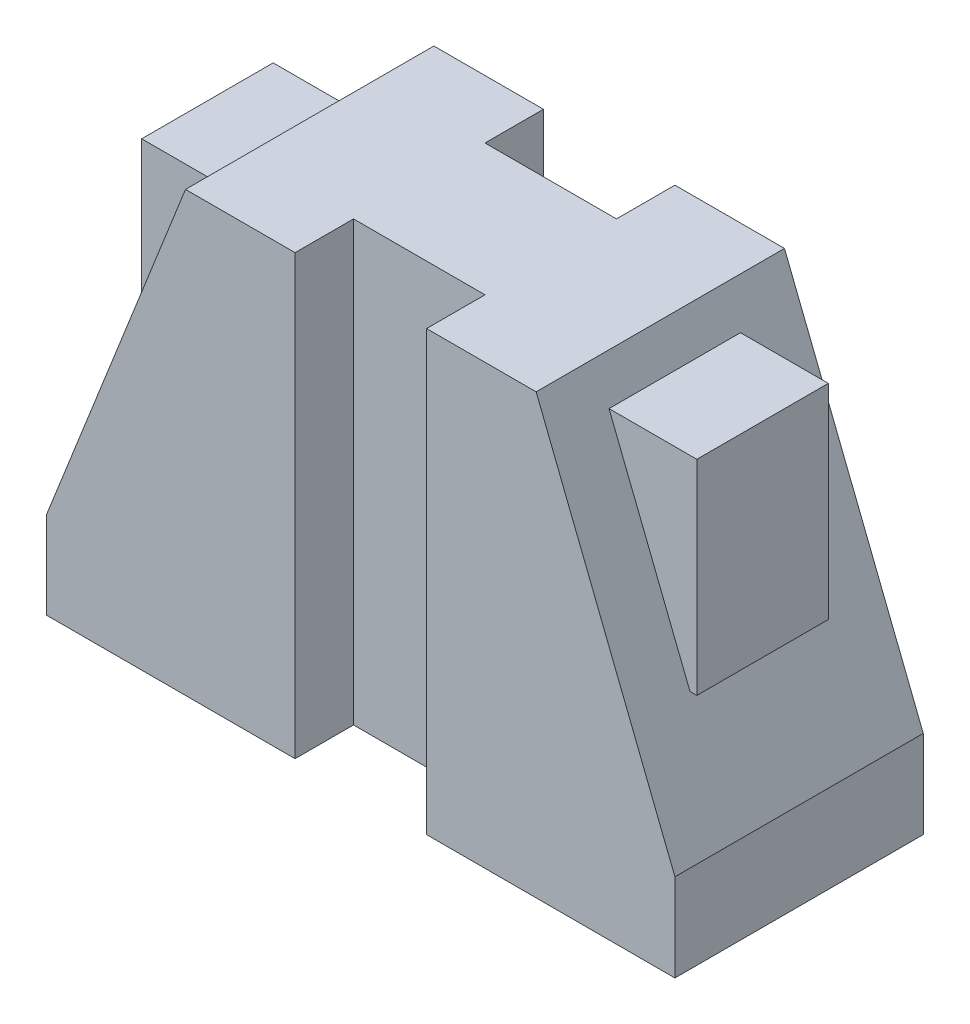
ISO-10303-21;
HEADER;
FILE_DESCRIPTION(('STEP AP214'),'2;1');
FILE_NAME('part.step','',(''),(''),'','','');
FILE_SCHEMA(('AUTOMOTIVE_DESIGN { 1 0 10303 214 1 1 1 1 }'));
ENDSEC;
DATA;
#1=APPLICATION_CONTEXT('core data for automotive mechanical design processes');
#2=APPLICATION_PROTOCOL_DEFINITION('international standard','automotive_design',2000,#1);
#3=PRODUCT_CONTEXT('',#1,'mechanical');
#4=PRODUCT('Part','Part','',(#3));
#5=PRODUCT_RELATED_PRODUCT_CATEGORY('part','',(#4));
#6=PRODUCT_DEFINITION_FORMATION('','',#4);
#7=PRODUCT_DEFINITION_CONTEXT('part definition',#1,'design');
#8=PRODUCT_DEFINITION('design','',#6,#7);
#9=PRODUCT_DEFINITION_SHAPE('','',#8);
#10=(LENGTH_UNIT() NAMED_UNIT(*) SI_UNIT(.MILLI.,.METRE.));
#11=(NAMED_UNIT(*) PLANE_ANGLE_UNIT() SI_UNIT($,.RADIAN.));
#12=(NAMED_UNIT(*) SI_UNIT($,.STERADIAN.) SOLID_ANGLE_UNIT());
#13=UNCERTAINTY_MEASURE_WITH_UNIT(LENGTH_MEASURE(1.E-05),#10,'distance_accuracy_value','');
#14=(GEOMETRIC_REPRESENTATION_CONTEXT(3) GLOBAL_UNCERTAINTY_ASSIGNED_CONTEXT((#13)) GLOBAL_UNIT_ASSIGNED_CONTEXT((#10,
#11,#12)) REPRESENTATION_CONTEXT('',''));
#15=CARTESIAN_POINT('',(0.,0.,0.));
#16=DIRECTION('',(0.,0.,1.));
#17=DIRECTION('',(1.,0.,0.));
#18=AXIS2_PLACEMENT_3D('',#15,#16,#17);
#19=CARTESIAN_POINT('',(-43.,-18.,-17.));
#20=DIRECTION('',(0.929806613071272,-0.368048451007378,0.));
#21=DIRECTION('',(0.368048451007378,0.929806613071272,0.));
#22=AXIS2_PLACEMENT_3D('',#19,#20,#21);
#23=PLANE('',#22);
#24=DIRECTION('',(0.,0.,1.));
#25=VECTOR('',#24,1.);
#26=CARTESIAN_POINT('',(-24.,30.,-17.));
#27=LINE('',#26,#25);
#28=CARTESIAN_POINT('',(-24.,30.,-17.));
#29=VERTEX_POINT('',#28);
#30=CARTESIAN_POINT('',(-24.,30.,17.));
#31=VERTEX_POINT('',#30);
#32=EDGE_CURVE('E231',#29,#31,#27,.T.);
#33=ORIENTED_EDGE('',*,*,#32,.F.);
#34=DIRECTION('',(0.368048451007378,0.929806613071272,0.));
#35=VECTOR('',#34,1.);
#36=CARTESIAN_POINT('',(-43.,-18.,-17.));
#37=LINE('',#36,#35);
#38=CARTESIAN_POINT('',(-43.,-18.,-17.));
#39=VERTEX_POINT('',#38);
#40=EDGE_CURVE('E227',#39,#29,#37,.T.);
#41=ORIENTED_EDGE('',*,*,#40,.F.);
#42=DIRECTION('',(0.,0.,1.));
#43=VECTOR('',#42,1.);
#44=CARTESIAN_POINT('',(-43.,-18.,-17.));
#45=LINE('',#44,#43);
#46=CARTESIAN_POINT('',(-43.,-18.,17.));
#47=VERTEX_POINT('',#46);
#48=EDGE_CURVE('E230',#39,#47,#45,.T.);
#49=ORIENTED_EDGE('',*,*,#48,.T.);
#50=DIRECTION('',(0.368048451007378,0.929806613071272,0.));
#51=VECTOR('',#50,1.);
#52=CARTESIAN_POINT('',(-43.,-18.,17.));
#53=LINE('',#52,#51);
#54=EDGE_CURVE('E224',#47,#31,#53,.T.);
#55=ORIENTED_EDGE('',*,*,#54,.T.);
#56=EDGE_LOOP('',(#33,#41,#49,#55));
#57=FACE_BOUND('',#56,.T.);
#58=DIRECTION('',(-0.368048451007378,-0.929806613071272,0.));
#59=VECTOR('',#58,1.);
#60=CARTESIAN_POINT('',(-43.,-18.,-9.));
#61=LINE('',#60,#59);
#62=CARTESIAN_POINT('',(-25.9791666666667,25.,-9.));
#63=VERTEX_POINT('',#62);
#64=CARTESIAN_POINT('',(-37.0625,-3.,-9.));
#65=VERTEX_POINT('',#64);
#66=EDGE_CURVE('E48',#63,#65,#61,.T.);
#67=ORIENTED_EDGE('',*,*,#66,.F.);
#68=DIRECTION('',(0.,0.,-1.));
#69=VECTOR('',#68,1.);
#70=CARTESIAN_POINT('',(-25.9791666666667,25.,-17.));
#71=LINE('',#70,#69);
#72=CARTESIAN_POINT('',(-25.9791666666667,25.,9.));
#73=VERTEX_POINT('',#72);
#74=EDGE_CURVE('E52',#73,#63,#71,.T.);
#75=ORIENTED_EDGE('',*,*,#74,.F.);
#76=DIRECTION('',(0.368048451007378,0.929806613071272,0.));
#77=VECTOR('',#76,1.);
#78=CARTESIAN_POINT('',(-43.,-18.,9.));
#79=LINE('',#78,#77);
#80=CARTESIAN_POINT('',(-37.0625,-3.,9.));
#81=VERTEX_POINT('',#80);
#82=EDGE_CURVE('E207',#81,#73,#79,.T.);
#83=ORIENTED_EDGE('',*,*,#82,.F.);
#84=DIRECTION('',(0.,0.,1.));
#85=VECTOR('',#84,1.);
#86=CARTESIAN_POINT('',(-37.0625,-3.,-17.));
#87=LINE('',#86,#85);
#88=EDGE_CURVE('E203',#65,#81,#87,.T.);
#89=ORIENTED_EDGE('',*,*,#88,.F.);
#90=EDGE_LOOP('',(#67,#75,#83,#89));
#91=FACE_BOUND('',#90,.T.);
#92=ADVANCED_FACE('F33',(#57,#91),#23,.F.);
#93=CARTESIAN_POINT('',(43.,-18.,-17.));
#94=DIRECTION('',(0.929806613071272,0.368048451007378,0.));
#95=DIRECTION('',(-0.368048451007378,0.929806613071272,0.));
#96=AXIS2_PLACEMENT_3D('',#93,#94,#95);
#97=PLANE('',#96);
#98=DIRECTION('',(0.,0.,1.));
#99=VECTOR('',#98,1.);
#100=CARTESIAN_POINT('',(43.,-18.,-17.));
#101=LINE('',#100,#99);
#102=CARTESIAN_POINT('',(43.,-18.,-17.));
#103=VERTEX_POINT('',#102);
#104=CARTESIAN_POINT('',(43.,-18.,17.));
#105=VERTEX_POINT('',#104);
#106=EDGE_CURVE('E221',#103,#105,#101,.T.);
#107=ORIENTED_EDGE('',*,*,#106,.F.);
#108=DIRECTION('',(-0.368048451007378,0.929806613071272,0.));
#109=VECTOR('',#108,1.);
#110=CARTESIAN_POINT('',(43.,-18.,-17.));
#111=LINE('',#110,#109);
#112=CARTESIAN_POINT('',(24.,30.,-17.));
#113=VERTEX_POINT('',#112);
#114=EDGE_CURVE('E218',#103,#113,#111,.T.);
#115=ORIENTED_EDGE('',*,*,#114,.T.);
#116=DIRECTION('',(0.,0.,1.));
#117=VECTOR('',#116,1.);
#118=CARTESIAN_POINT('',(24.,30.,-17.));
#119=LINE('',#118,#117);
#120=CARTESIAN_POINT('',(24.,30.,17.));
#121=VERTEX_POINT('',#120);
#122=EDGE_CURVE('E220',#113,#121,#119,.T.);
#123=ORIENTED_EDGE('',*,*,#122,.T.);
#124=DIRECTION('',(-0.368048451007378,0.929806613071272,0.));
#125=VECTOR('',#124,1.);
#126=CARTESIAN_POINT('',(43.,-18.,17.));
#127=LINE('',#126,#125);
#128=EDGE_CURVE('E215',#105,#121,#127,.T.);
#129=ORIENTED_EDGE('',*,*,#128,.F.);
#130=EDGE_LOOP('',(#107,#115,#123,#129));
#131=FACE_BOUND('',#130,.T.);
#132=DIRECTION('',(0.,0.,-1.));
#133=VECTOR('',#132,1.);
#134=CARTESIAN_POINT('',(25.9791666666667,25.,-17.));
#135=LINE('',#134,#133);
#136=CARTESIAN_POINT('',(25.9791666666667,25.,9.));
#137=VERTEX_POINT('',#136);
#138=CARTESIAN_POINT('',(25.9791666666667,25.,-9.));
#139=VERTEX_POINT('',#138);
#140=EDGE_CURVE('E41',#137,#139,#135,.T.);
#141=ORIENTED_EDGE('',*,*,#140,.T.);
#142=DIRECTION('',(0.368048451007378,-0.929806613071272,0.));
#143=VECTOR('',#142,1.);
#144=CARTESIAN_POINT('',(43.,-18.,-9.));
#145=LINE('',#144,#143);
#146=CARTESIAN_POINT('',(37.0625,-3.,-9.));
#147=VERTEX_POINT('',#146);
#148=EDGE_CURVE('E11',#139,#147,#145,.T.);
#149=ORIENTED_EDGE('',*,*,#148,.T.);
#150=DIRECTION('',(0.,0.,1.));
#151=VECTOR('',#150,1.);
#152=CARTESIAN_POINT('',(37.0625,-3.,-17.));
#153=LINE('',#152,#151);
#154=CARTESIAN_POINT('',(37.0625,-3.,9.));
#155=VERTEX_POINT('',#154);
#156=EDGE_CURVE('E316',#147,#155,#153,.T.);
#157=ORIENTED_EDGE('',*,*,#156,.T.);
#158=DIRECTION('',(-0.368048451007378,0.929806613071272,0.));
#159=VECTOR('',#158,1.);
#160=CARTESIAN_POINT('',(43.,-18.,9.));
#161=LINE('',#160,#159);
#162=EDGE_CURVE('E319',#155,#137,#161,.T.);
#163=ORIENTED_EDGE('',*,*,#162,.T.);
#164=EDGE_LOOP('',(#141,#149,#157,#163));
#165=FACE_BOUND('',#164,.T.);
#166=ADVANCED_FACE('F322',(#131,#165),#97,.T.);
#167=CARTESIAN_POINT('',(-43.,30.,17.));
#168=DIRECTION('',(0.,-1.,0.));
#169=DIRECTION('',(0.,0.,-1.));
#170=AXIS2_PLACEMENT_3D('',#167,#168,#169);
#171=PLANE('',#170);
#172=ORIENTED_EDGE('',*,*,#122,.F.);
#173=DIRECTION('',(-1.,0.,0.));
#174=VECTOR('',#173,1.);
#175=CARTESIAN_POINT('',(-43.,30.,-17.));
#176=LINE('',#175,#174);
#177=CARTESIAN_POINT('',(9.,30.,-17.));
#178=VERTEX_POINT('',#177);
#179=EDGE_CURVE('E304',#113,#178,#176,.T.);
#180=ORIENTED_EDGE('',*,*,#179,.T.);
#181=DIRECTION('',(0.,0.,1.));
#182=VECTOR('',#181,1.);
#183=CARTESIAN_POINT('',(9.,30.,-9.));
#184=LINE('',#183,#182);
#185=CARTESIAN_POINT('',(9.,30.,-9.));
#186=VERTEX_POINT('',#185);
#187=EDGE_CURVE('E234',#178,#186,#184,.T.);
#188=ORIENTED_EDGE('',*,*,#187,.T.);
#189=DIRECTION('',(-1.,0.,0.));
#190=VECTOR('',#189,1.);
#191=CARTESIAN_POINT('',(-9.,30.,-9.));
#192=LINE('',#191,#190);
#193=CARTESIAN_POINT('',(-9.,30.,-9.));
#194=VERTEX_POINT('',#193);
#195=EDGE_CURVE('E241',#186,#194,#192,.T.);
#196=ORIENTED_EDGE('',*,*,#195,.T.);
#197=DIRECTION('',(0.,0.,-1.));
#198=VECTOR('',#197,1.);
#199=CARTESIAN_POINT('',(-9.,30.,-9.));
#200=LINE('',#199,#198);
#201=CARTESIAN_POINT('',(-9.,30.,-17.));
#202=VERTEX_POINT('',#201);
#203=EDGE_CURVE('E238',#194,#202,#200,.T.);
#204=ORIENTED_EDGE('',*,*,#203,.T.);
#205=EDGE_CURVE('E303',#202,#29,#176,.T.);
#206=ORIENTED_EDGE('',*,*,#205,.T.);
#207=ORIENTED_EDGE('',*,*,#32,.T.);
#208=DIRECTION('',(-1.,0.,0.));
#209=VECTOR('',#208,1.);
#210=CARTESIAN_POINT('',(-43.,30.,17.));
#211=LINE('',#210,#209);
#212=CARTESIAN_POINT('',(-9.,30.,17.));
#213=VERTEX_POINT('',#212);
#214=EDGE_CURVE('E290',#213,#31,#211,.T.);
#215=ORIENTED_EDGE('',*,*,#214,.F.);
#216=DIRECTION('',(0.,0.,1.));
#217=VECTOR('',#216,1.);
#218=CARTESIAN_POINT('',(-9.,30.,9.));
#219=LINE('',#218,#217);
#220=CARTESIAN_POINT('',(-9.,30.,9.));
#221=VERTEX_POINT('',#220);
#222=EDGE_CURVE('E265',#221,#213,#219,.T.);
#223=ORIENTED_EDGE('',*,*,#222,.F.);
#224=DIRECTION('',(-1.,0.,0.));
#225=VECTOR('',#224,1.);
#226=CARTESIAN_POINT('',(-9.,30.,9.));
#227=LINE('',#226,#225);
#228=CARTESIAN_POINT('',(9.,30.,9.));
#229=VERTEX_POINT('',#228);
#230=EDGE_CURVE('E262',#229,#221,#227,.T.);
#231=ORIENTED_EDGE('',*,*,#230,.F.);
#232=DIRECTION('',(0.,0.,-1.));
#233=VECTOR('',#232,1.);
#234=CARTESIAN_POINT('',(9.,30.,9.));
#235=LINE('',#234,#233);
#236=CARTESIAN_POINT('',(9.,30.,17.));
#237=VERTEX_POINT('',#236);
#238=EDGE_CURVE('E253',#237,#229,#235,.T.);
#239=ORIENTED_EDGE('',*,*,#238,.F.);
#240=EDGE_CURVE('E292',#121,#237,#211,.T.);
#241=ORIENTED_EDGE('',*,*,#240,.F.);
#242=EDGE_LOOP('',(#172,#180,#188,#196,#204,#206,#207,#215,#223,#231,#239,#241));
#243=FACE_BOUND('',#242,.T.);
#244=ADVANCED_FACE('F371',(#243),#171,.F.);
#245=CARTESIAN_POINT('',(0.,0.,-17.));
#246=DIRECTION('',(0.,0.,-1.));
#247=DIRECTION('',(-1.,0.,0.));
#248=AXIS2_PLACEMENT_3D('',#245,#246,#247);
#249=PLANE('',#248);
#250=ORIENTED_EDGE('',*,*,#179,.F.);
#251=ORIENTED_EDGE('',*,*,#114,.F.);
#252=DIRECTION('',(0.,1.,0.));
#253=VECTOR('',#252,1.);
#254=CARTESIAN_POINT('',(43.,-30.,-17.));
#255=LINE('',#254,#253);
#256=CARTESIAN_POINT('',(43.,-30.,-17.));
#257=VERTEX_POINT('',#256);
#258=EDGE_CURVE('E280',#257,#103,#255,.T.);
#259=ORIENTED_EDGE('',*,*,#258,.F.);
#260=DIRECTION('',(1.,0.,0.));
#261=VECTOR('',#260,1.);
#262=CARTESIAN_POINT('',(-43.,-30.,-17.));
#263=LINE('',#262,#261);
#264=CARTESIAN_POINT('',(9.,-30.,-17.));
#265=VERTEX_POINT('',#264);
#266=EDGE_CURVE('E308',#265,#257,#263,.T.);
#267=ORIENTED_EDGE('',*,*,#266,.F.);
#268=DIRECTION('',(0.,1.,0.));
#269=VECTOR('',#268,1.);
#270=CARTESIAN_POINT('',(9.,-30.,-17.));
#271=LINE('',#270,#269);
#272=EDGE_CURVE('E250',#265,#178,#271,.T.);
#273=ORIENTED_EDGE('',*,*,#272,.T.);
#274=EDGE_LOOP('',(#250,#251,#259,#267,#273));
#275=FACE_BOUND('',#274,.T.);
#276=ADVANCED_FACE('F405',(#275),#249,.T.);
#277=CARTESIAN_POINT('',(0.,0.,17.));
#278=DIRECTION('',(0.,0.,-1.));
#279=DIRECTION('',(-1.,0.,0.));
#280=AXIS2_PLACEMENT_3D('',#277,#278,#279);
#281=PLANE('',#280);
#282=ORIENTED_EDGE('',*,*,#128,.T.);
#283=ORIENTED_EDGE('',*,*,#240,.T.);
#284=DIRECTION('',(0.,1.,0.));
#285=VECTOR('',#284,1.);
#286=CARTESIAN_POINT('',(9.,-30.,17.));
#287=LINE('',#286,#285);
#288=CARTESIAN_POINT('',(9.,-30.,17.));
#289=VERTEX_POINT('',#288);
#290=EDGE_CURVE('E277',#289,#237,#287,.T.);
#291=ORIENTED_EDGE('',*,*,#290,.F.);
#292=DIRECTION('',(1.,0.,0.));
#293=VECTOR('',#292,1.);
#294=CARTESIAN_POINT('',(-43.,-30.,17.));
#295=LINE('',#294,#293);
#296=CARTESIAN_POINT('',(43.,-30.,17.));
#297=VERTEX_POINT('',#296);
#298=EDGE_CURVE('E296',#289,#297,#295,.T.);
#299=ORIENTED_EDGE('',*,*,#298,.T.);
#300=DIRECTION('',(0.,1.,0.));
#301=VECTOR('',#300,1.);
#302=CARTESIAN_POINT('',(43.,-30.,17.));
#303=LINE('',#302,#301);
#304=EDGE_CURVE('E287',#297,#105,#303,.T.);
#305=ORIENTED_EDGE('',*,*,#304,.T.);
#306=EDGE_LOOP('',(#282,#283,#291,#299,#305));
#307=FACE_BOUND('',#306,.T.);
#308=ADVANCED_FACE('F404',(#307),#281,.F.);
#309=CARTESIAN_POINT('',(43.,-30.,17.));
#310=DIRECTION('',(-1.,0.,0.));
#311=DIRECTION('',(0.,0.,1.));
#312=AXIS2_PLACEMENT_3D('',#309,#310,#311);
#313=PLANE('',#312);
#314=ORIENTED_EDGE('',*,*,#106,.T.);
#315=ORIENTED_EDGE('',*,*,#304,.F.);
#316=DIRECTION('',(0.,0.,-1.));
#317=VECTOR('',#316,1.);
#318=CARTESIAN_POINT('',(43.,-30.,17.));
#319=LINE('',#318,#317);
#320=EDGE_CURVE('E300',#297,#257,#319,.T.);
#321=ORIENTED_EDGE('',*,*,#320,.T.);
#322=ORIENTED_EDGE('',*,*,#258,.T.);
#323=EDGE_LOOP('',(#314,#315,#321,#322));
#324=FACE_BOUND('',#323,.T.);
#325=ADVANCED_FACE('F35',(#324),#313,.F.);
#326=CARTESIAN_POINT('',(-43.,-30.,17.));
#327=DIRECTION('',(0.,1.,0.));
#328=DIRECTION('',(0.,0.,1.));
#329=AXIS2_PLACEMENT_3D('',#326,#327,#328);
#330=PLANE('',#329);
#331=DIRECTION('',(0.,0.,1.));
#332=VECTOR('',#331,1.);
#333=CARTESIAN_POINT('',(9.,-30.,-9.));
#334=LINE('',#333,#332);
#335=CARTESIAN_POINT('',(9.,-30.,-9.));
#336=VERTEX_POINT('',#335);
#337=EDGE_CURVE('E244',#265,#336,#334,.T.);
#338=ORIENTED_EDGE('',*,*,#337,.F.);
#339=ORIENTED_EDGE('',*,*,#266,.T.);
#340=ORIENTED_EDGE('',*,*,#320,.F.);
#341=ORIENTED_EDGE('',*,*,#298,.F.);
#342=DIRECTION('',(0.,0.,-1.));
#343=VECTOR('',#342,1.);
#344=CARTESIAN_POINT('',(9.,-30.,9.));
#345=LINE('',#344,#343);
#346=CARTESIAN_POINT('',(9.,-30.,9.));
#347=VERTEX_POINT('',#346);
#348=EDGE_CURVE('E267',#289,#347,#345,.T.);
#349=ORIENTED_EDGE('',*,*,#348,.T.);
#350=DIRECTION('',(-1.,0.,0.));
#351=VECTOR('',#350,1.);
#352=CARTESIAN_POINT('',(-9.,-30.,9.));
#353=LINE('',#352,#351);
#354=CARTESIAN_POINT('',(-9.,-30.,9.));
#355=VERTEX_POINT('',#354);
#356=EDGE_CURVE('E270',#347,#355,#353,.T.);
#357=ORIENTED_EDGE('',*,*,#356,.T.);
#358=DIRECTION('',(0.,0.,1.));
#359=VECTOR('',#358,1.);
#360=CARTESIAN_POINT('',(-9.,-30.,9.));
#361=LINE('',#360,#359);
#362=CARTESIAN_POINT('',(-9.,-30.,17.));
#363=VERTEX_POINT('',#362);
#364=EDGE_CURVE('E273',#355,#363,#361,.T.);
#365=ORIENTED_EDGE('',*,*,#364,.T.);
#366=CARTESIAN_POINT('',(-43.,-30.,17.));
#367=VERTEX_POINT('',#366);
#368=EDGE_CURVE('E297',#367,#363,#295,.T.);
#369=ORIENTED_EDGE('',*,*,#368,.F.);
#370=DIRECTION('',(0.,0.,-1.));
#371=VECTOR('',#370,1.);
#372=CARTESIAN_POINT('',(-43.,-30.,17.));
#373=LINE('',#372,#371);
#374=CARTESIAN_POINT('',(-43.,-30.,-17.));
#375=VERTEX_POINT('',#374);
#376=EDGE_CURVE('E313',#367,#375,#373,.T.);
#377=ORIENTED_EDGE('',*,*,#376,.T.);
#378=CARTESIAN_POINT('',(-9.,-30.,-17.));
#379=VERTEX_POINT('',#378);
#380=EDGE_CURVE('E291',#375,#379,#263,.T.);
#381=ORIENTED_EDGE('',*,*,#380,.T.);
#382=DIRECTION('',(0.,0.,-1.));
#383=VECTOR('',#382,1.);
#384=CARTESIAN_POINT('',(-9.,-30.,-9.));
#385=LINE('',#384,#383);
#386=CARTESIAN_POINT('',(-9.,-30.,-9.));
#387=VERTEX_POINT('',#386);
#388=EDGE_CURVE('E246',#387,#379,#385,.T.);
#389=ORIENTED_EDGE('',*,*,#388,.F.);
#390=DIRECTION('',(-1.,0.,0.));
#391=VECTOR('',#390,1.);
#392=CARTESIAN_POINT('',(-9.,-30.,-9.));
#393=LINE('',#392,#391);
#394=EDGE_CURVE('E248',#336,#387,#393,.T.);
#395=ORIENTED_EDGE('',*,*,#394,.F.);
#396=EDGE_LOOP('',(#338,#339,#340,#341,#349,#357,#365,#369,#377,#381,#389,#395));
#397=FACE_BOUND('',#396,.T.);
#398=ADVANCED_FACE('F410',(#397),#330,.F.);
#399=ORIENTED_EDGE('',*,*,#40,.T.);
#400=ORIENTED_EDGE('',*,*,#205,.F.);
#401=DIRECTION('',(0.,1.,0.));
#402=VECTOR('',#401,1.);
#403=CARTESIAN_POINT('',(-9.,-30.,-17.));
#404=LINE('',#403,#402);
#405=EDGE_CURVE('E256',#379,#202,#404,.T.);
#406=ORIENTED_EDGE('',*,*,#405,.F.);
#407=ORIENTED_EDGE('',*,*,#380,.F.);
#408=DIRECTION('',(0.,-1.,0.));
#409=VECTOR('',#408,1.);
#410=CARTESIAN_POINT('',(-43.,-30.,-17.));
#411=LINE('',#410,#409);
#412=EDGE_CURVE('E306',#39,#375,#411,.T.);
#413=ORIENTED_EDGE('',*,*,#412,.F.);
#414=EDGE_LOOP('',(#399,#400,#406,#407,#413));
#415=FACE_BOUND('',#414,.T.);
#416=ADVANCED_FACE('F409',(#415),#249,.T.);
#417=CARTESIAN_POINT('',(-43.,-30.,17.));
#418=DIRECTION('',(1.,0.,0.));
#419=DIRECTION('',(0.,0.,-1.));
#420=AXIS2_PLACEMENT_3D('',#417,#418,#419);
#421=PLANE('',#420);
#422=DIRECTION('',(0.,-1.,0.));
#423=VECTOR('',#422,1.);
#424=CARTESIAN_POINT('',(-43.,-30.,17.));
#425=LINE('',#424,#423);
#426=EDGE_CURVE('E294',#47,#367,#425,.T.);
#427=ORIENTED_EDGE('',*,*,#426,.F.);
#428=ORIENTED_EDGE('',*,*,#48,.F.);
#429=ORIENTED_EDGE('',*,*,#412,.T.);
#430=ORIENTED_EDGE('',*,*,#376,.F.);
#431=EDGE_LOOP('',(#427,#428,#429,#430));
#432=FACE_BOUND('',#431,.T.);
#433=ADVANCED_FACE('F402',(#432),#421,.F.);
#434=ORIENTED_EDGE('',*,*,#214,.T.);
#435=ORIENTED_EDGE('',*,*,#54,.F.);
#436=ORIENTED_EDGE('',*,*,#426,.T.);
#437=ORIENTED_EDGE('',*,*,#368,.T.);
#438=DIRECTION('',(0.,1.,0.));
#439=VECTOR('',#438,1.);
#440=CARTESIAN_POINT('',(-9.,-30.,17.));
#441=LINE('',#440,#439);
#442=EDGE_CURVE('E281',#363,#213,#441,.T.);
#443=ORIENTED_EDGE('',*,*,#442,.T.);
#444=EDGE_LOOP('',(#434,#435,#436,#437,#443));
#445=FACE_BOUND('',#444,.T.);
#446=ADVANCED_FACE('F398',(#445),#281,.F.);
#447=CARTESIAN_POINT('',(9.,-30.,9.));
#448=DIRECTION('',(1.,0.,0.));
#449=DIRECTION('',(0.,0.,-1.));
#450=AXIS2_PLACEMENT_3D('',#447,#448,#449);
#451=PLANE('',#450);
#452=DIRECTION('',(0.,1.,0.));
#453=VECTOR('',#452,1.);
#454=CARTESIAN_POINT('',(9.,-30.,9.));
#455=LINE('',#454,#453);
#456=EDGE_CURVE('E276',#347,#229,#455,.T.);
#457=ORIENTED_EDGE('',*,*,#456,.F.);
#458=ORIENTED_EDGE('',*,*,#348,.F.);
#459=ORIENTED_EDGE('',*,*,#290,.T.);
#460=ORIENTED_EDGE('',*,*,#238,.T.);
#461=EDGE_LOOP('',(#457,#458,#459,#460));
#462=FACE_BOUND('',#461,.T.);
#463=ADVANCED_FACE('F391',(#462),#451,.F.);
#464=CARTESIAN_POINT('',(-9.,-30.,9.));
#465=DIRECTION('',(-1.,0.,0.));
#466=DIRECTION('',(0.,0.,1.));
#467=AXIS2_PLACEMENT_3D('',#464,#465,#466);
#468=PLANE('',#467);
#469=ORIENTED_EDGE('',*,*,#442,.F.);
#470=ORIENTED_EDGE('',*,*,#364,.F.);
#471=DIRECTION('',(0.,1.,0.));
#472=VECTOR('',#471,1.);
#473=CARTESIAN_POINT('',(-9.,-30.,9.));
#474=LINE('',#473,#472);
#475=EDGE_CURVE('E284',#355,#221,#474,.T.);
#476=ORIENTED_EDGE('',*,*,#475,.T.);
#477=ORIENTED_EDGE('',*,*,#222,.T.);
#478=EDGE_LOOP('',(#469,#470,#476,#477));
#479=FACE_BOUND('',#478,.T.);
#480=ADVANCED_FACE('F388',(#479),#468,.F.);
#481=CARTESIAN_POINT('',(-9.,-30.,9.));
#482=DIRECTION('',(0.,0.,-1.));
#483=DIRECTION('',(-1.,0.,0.));
#484=AXIS2_PLACEMENT_3D('',#481,#482,#483);
#485=PLANE('',#484);
#486=ORIENTED_EDGE('',*,*,#456,.T.);
#487=ORIENTED_EDGE('',*,*,#230,.T.);
#488=ORIENTED_EDGE('',*,*,#475,.F.);
#489=ORIENTED_EDGE('',*,*,#356,.F.);
#490=EDGE_LOOP('',(#486,#487,#488,#489));
#491=FACE_BOUND('',#490,.T.);
#492=ADVANCED_FACE('F386',(#491),#485,.F.);
#493=CARTESIAN_POINT('',(9.,-30.,-9.));
#494=DIRECTION('',(-1.,0.,0.));
#495=DIRECTION('',(0.,0.,1.));
#496=AXIS2_PLACEMENT_3D('',#493,#494,#495);
#497=PLANE('',#496);
#498=ORIENTED_EDGE('',*,*,#272,.F.);
#499=ORIENTED_EDGE('',*,*,#337,.T.);
#500=DIRECTION('',(0.,1.,0.));
#501=VECTOR('',#500,1.);
#502=CARTESIAN_POINT('',(9.,-30.,-9.));
#503=LINE('',#502,#501);
#504=EDGE_CURVE('E251',#336,#186,#503,.T.);
#505=ORIENTED_EDGE('',*,*,#504,.T.);
#506=ORIENTED_EDGE('',*,*,#187,.F.);
#507=EDGE_LOOP('',(#498,#499,#505,#506));
#508=FACE_BOUND('',#507,.T.);
#509=ADVANCED_FACE('F379',(#508),#497,.T.);
#510=CARTESIAN_POINT('',(-9.,-30.,-9.));
#511=DIRECTION('',(0.,0.,-1.));
#512=DIRECTION('',(-1.,0.,0.));
#513=AXIS2_PLACEMENT_3D('',#510,#511,#512);
#514=PLANE('',#513);
#515=DIRECTION('',(0.,1.,0.));
#516=VECTOR('',#515,1.);
#517=CARTESIAN_POINT('',(-9.,-30.,-9.));
#518=LINE('',#517,#516);
#519=EDGE_CURVE('E254',#387,#194,#518,.T.);
#520=ORIENTED_EDGE('',*,*,#519,.T.);
#521=ORIENTED_EDGE('',*,*,#195,.F.);
#522=ORIENTED_EDGE('',*,*,#504,.F.);
#523=ORIENTED_EDGE('',*,*,#394,.T.);
#524=EDGE_LOOP('',(#520,#521,#522,#523));
#525=FACE_BOUND('',#524,.T.);
#526=ADVANCED_FACE('F376',(#525),#514,.T.);
#527=CARTESIAN_POINT('',(-9.,-30.,-9.));
#528=DIRECTION('',(1.,0.,0.));
#529=DIRECTION('',(0.,0.,-1.));
#530=AXIS2_PLACEMENT_3D('',#527,#528,#529);
#531=PLANE('',#530);
#532=ORIENTED_EDGE('',*,*,#519,.F.);
#533=ORIENTED_EDGE('',*,*,#388,.T.);
#534=ORIENTED_EDGE('',*,*,#405,.T.);
#535=ORIENTED_EDGE('',*,*,#203,.F.);
#536=EDGE_LOOP('',(#532,#533,#534,#535));
#537=FACE_BOUND('',#536,.T.);
#538=ADVANCED_FACE('F359',(#537),#531,.T.);
#539=CARTESIAN_POINT('',(38.,0.,0.));
#540=DIRECTION('',(1.,0.,0.));
#541=DIRECTION('',(0.,0.,-1.));
#542=AXIS2_PLACEMENT_3D('',#539,#540,#541);
#543=PLANE('',#542);
#544=DIRECTION('',(0.,1.,0.));
#545=VECTOR('',#544,1.);
#546=CARTESIAN_POINT('',(38.,25.,-9.));
#547=LINE('',#546,#545);
#548=CARTESIAN_POINT('',(38.,-3.,-9.));
#549=VERTEX_POINT('',#548);
#550=CARTESIAN_POINT('',(38.,25.,-9.));
#551=VERTEX_POINT('',#550);
#552=EDGE_CURVE('E191',#549,#551,#547,.T.);
#553=ORIENTED_EDGE('',*,*,#552,.T.);
#554=DIRECTION('',(0.,0.,1.));
#555=VECTOR('',#554,1.);
#556=CARTESIAN_POINT('',(38.,25.,9.));
#557=LINE('',#556,#555);
#558=CARTESIAN_POINT('',(38.,25.,9.));
#559=VERTEX_POINT('',#558);
#560=EDGE_CURVE('E180',#551,#559,#557,.T.);
#561=ORIENTED_EDGE('',*,*,#560,.T.);
#562=DIRECTION('',(0.,-1.,0.));
#563=VECTOR('',#562,1.);
#564=CARTESIAN_POINT('',(38.,25.,9.));
#565=LINE('',#564,#563);
#566=CARTESIAN_POINT('',(38.,-3.,9.));
#567=VERTEX_POINT('',#566);
#568=EDGE_CURVE('E190',#559,#567,#565,.T.);
#569=ORIENTED_EDGE('',*,*,#568,.T.);
#570=DIRECTION('',(0.,0.,-1.));
#571=VECTOR('',#570,1.);
#572=CARTESIAN_POINT('',(38.,-3.,9.));
#573=LINE('',#572,#571);
#574=EDGE_CURVE('E196',#567,#549,#573,.T.);
#575=ORIENTED_EDGE('',*,*,#574,.T.);
#576=EDGE_LOOP('',(#553,#561,#569,#575));
#577=FACE_BOUND('',#576,.T.);
#578=ADVANCED_FACE('F194',(#577),#543,.T.);
#579=CARTESIAN_POINT('',(38.,-3.,9.));
#580=DIRECTION('',(0.,1.,0.));
#581=DIRECTION('',(0.,0.,1.));
#582=AXIS2_PLACEMENT_3D('',#579,#580,#581);
#583=PLANE('',#582);
#584=ORIENTED_EDGE('',*,*,#156,.F.);
#585=DIRECTION('',(-1.,0.,0.));
#586=VECTOR('',#585,1.);
#587=CARTESIAN_POINT('',(38.,-3.,-9.));
#588=LINE('',#587,#586);
#589=EDGE_CURVE('E335',#549,#147,#588,.T.);
#590=ORIENTED_EDGE('',*,*,#589,.F.);
#591=ORIENTED_EDGE('',*,*,#574,.F.);
#592=DIRECTION('',(-1.,0.,0.));
#593=VECTOR('',#592,1.);
#594=CARTESIAN_POINT('',(38.,-3.,9.));
#595=LINE('',#594,#593);
#596=EDGE_CURVE('E328',#567,#155,#595,.T.);
#597=ORIENTED_EDGE('',*,*,#596,.T.);
#598=EDGE_LOOP('',(#584,#590,#591,#597));
#599=FACE_BOUND('',#598,.T.);
#600=ADVANCED_FACE('F349',(#599),#583,.F.);
#601=CARTESIAN_POINT('',(38.,25.,9.));
#602=DIRECTION('',(0.,0.,-1.));
#603=DIRECTION('',(-1.,0.,0.));
#604=AXIS2_PLACEMENT_3D('',#601,#602,#603);
#605=PLANE('',#604);
#606=ORIENTED_EDGE('',*,*,#162,.F.);
#607=ORIENTED_EDGE('',*,*,#596,.F.);
#608=ORIENTED_EDGE('',*,*,#568,.F.);
#609=DIRECTION('',(-1.,0.,0.));
#610=VECTOR('',#609,1.);
#611=CARTESIAN_POINT('',(38.,25.,9.));
#612=LINE('',#611,#610);
#613=EDGE_CURVE('E187',#559,#137,#612,.T.);
#614=ORIENTED_EDGE('',*,*,#613,.T.);
#615=EDGE_LOOP('',(#606,#607,#608,#614));
#616=FACE_BOUND('',#615,.T.);
#617=ADVANCED_FACE('F325',(#616),#605,.F.);
#618=CARTESIAN_POINT('',(38.,25.,9.));
#619=DIRECTION('',(0.,-1.,0.));
#620=DIRECTION('',(0.,0.,-1.));
#621=AXIS2_PLACEMENT_3D('',#618,#619,#620);
#622=PLANE('',#621);
#623=ORIENTED_EDGE('',*,*,#140,.F.);
#624=ORIENTED_EDGE('',*,*,#613,.F.);
#625=ORIENTED_EDGE('',*,*,#560,.F.);
#626=DIRECTION('',(-1.,0.,0.));
#627=VECTOR('',#626,1.);
#628=CARTESIAN_POINT('',(38.,25.,-9.));
#629=LINE('',#628,#627);
#630=EDGE_CURVE('E184',#551,#139,#629,.T.);
#631=ORIENTED_EDGE('',*,*,#630,.T.);
#632=EDGE_LOOP('',(#623,#624,#625,#631));
#633=FACE_BOUND('',#632,.T.);
#634=ADVANCED_FACE('F182',(#633),#622,.F.);
#635=CARTESIAN_POINT('',(38.,25.,-9.));
#636=DIRECTION('',(0.,0.,1.));
#637=DIRECTION('',(1.,0.,0.));
#638=AXIS2_PLACEMENT_3D('',#635,#636,#637);
#639=PLANE('',#638);
#640=ORIENTED_EDGE('',*,*,#148,.F.);
#641=ORIENTED_EDGE('',*,*,#630,.F.);
#642=ORIENTED_EDGE('',*,*,#552,.F.);
#643=ORIENTED_EDGE('',*,*,#589,.T.);
#644=EDGE_LOOP('',(#640,#641,#642,#643));
#645=FACE_BOUND('',#644,.T.);
#646=ADVANCED_FACE('F202',(#645),#639,.F.);
#647=CARTESIAN_POINT('',(-38.,25.,-9.));
#648=VERTEX_POINT('',#647);
#649=EDGE_CURVE('E204',#63,#648,#629,.T.);
#650=ORIENTED_EDGE('',*,*,#649,.F.);
#651=ORIENTED_EDGE('',*,*,#66,.T.);
#652=CARTESIAN_POINT('',(-38.,-3.,-9.));
#653=VERTEX_POINT('',#652);
#654=EDGE_CURVE('E338',#65,#653,#588,.T.);
#655=ORIENTED_EDGE('',*,*,#654,.T.);
#656=DIRECTION('',(0.,1.,0.));
#657=VECTOR('',#656,1.);
#658=CARTESIAN_POINT('',(-38.,25.,-9.));
#659=LINE('',#658,#657);
#660=EDGE_CURVE('E345',#653,#648,#659,.T.);
#661=ORIENTED_EDGE('',*,*,#660,.T.);
#662=EDGE_LOOP('',(#650,#651,#655,#661));
#663=FACE_BOUND('',#662,.T.);
#664=ADVANCED_FACE('F583',(#663),#639,.F.);
#665=CARTESIAN_POINT('',(-38.,25.,9.));
#666=VERTEX_POINT('',#665);
#667=EDGE_CURVE('E327',#73,#666,#612,.T.);
#668=ORIENTED_EDGE('',*,*,#667,.F.);
#669=ORIENTED_EDGE('',*,*,#74,.T.);
#670=ORIENTED_EDGE('',*,*,#649,.T.);
#671=DIRECTION('',(0.,0.,1.));
#672=VECTOR('',#671,1.);
#673=CARTESIAN_POINT('',(-38.,25.,9.));
#674=LINE('',#673,#672);
#675=EDGE_CURVE('E343',#648,#666,#674,.T.);
#676=ORIENTED_EDGE('',*,*,#675,.T.);
#677=EDGE_LOOP('',(#668,#669,#670,#676));
#678=FACE_BOUND('',#677,.T.);
#679=ADVANCED_FACE('F575',(#678),#622,.F.);
#680=CARTESIAN_POINT('',(-38.,-3.,9.));
#681=VERTEX_POINT('',#680);
#682=EDGE_CURVE('E333',#81,#681,#595,.T.);
#683=ORIENTED_EDGE('',*,*,#682,.F.);
#684=ORIENTED_EDGE('',*,*,#82,.T.);
#685=ORIENTED_EDGE('',*,*,#667,.T.);
#686=DIRECTION('',(0.,-1.,0.));
#687=VECTOR('',#686,1.);
#688=CARTESIAN_POINT('',(-38.,25.,9.));
#689=LINE('',#688,#687);
#690=EDGE_CURVE('E341',#666,#681,#689,.T.);
#691=ORIENTED_EDGE('',*,*,#690,.T.);
#692=EDGE_LOOP('',(#683,#684,#685,#691));
#693=FACE_BOUND('',#692,.T.);
#694=ADVANCED_FACE('F358',(#693),#605,.F.);
#695=ORIENTED_EDGE('',*,*,#654,.F.);
#696=ORIENTED_EDGE('',*,*,#88,.T.);
#697=ORIENTED_EDGE('',*,*,#682,.T.);
#698=DIRECTION('',(0.,0.,-1.));
#699=VECTOR('',#698,1.);
#700=CARTESIAN_POINT('',(-38.,-3.,9.));
#701=LINE('',#700,#699);
#702=EDGE_CURVE('E200',#681,#653,#701,.T.);
#703=ORIENTED_EDGE('',*,*,#702,.T.);
#704=EDGE_LOOP('',(#695,#696,#697,#703));
#705=FACE_BOUND('',#704,.T.);
#706=ADVANCED_FACE('F352',(#705),#583,.F.);
#707=CARTESIAN_POINT('',(-38.,0.,0.));
#708=DIRECTION('',(1.,0.,0.));
#709=DIRECTION('',(0.,0.,-1.));
#710=AXIS2_PLACEMENT_3D('',#707,#708,#709);
#711=PLANE('',#710);
#712=ORIENTED_EDGE('',*,*,#660,.F.);
#713=ORIENTED_EDGE('',*,*,#702,.F.);
#714=ORIENTED_EDGE('',*,*,#690,.F.);
#715=ORIENTED_EDGE('',*,*,#675,.F.);
#716=EDGE_LOOP('',(#712,#713,#714,#715));
#717=FACE_BOUND('',#716,.T.);
#718=ADVANCED_FACE('F363',(#717),#711,.F.);
#719=CLOSED_SHELL('',(#92,#166,#244,#276,#308,#325,#398,#416,#433,#446,#463,#480,#492,#509,#526,
#538,#578,#600,#617,#634,#646,#664,#679,#694,#706,#718));
#720=MANIFOLD_SOLID_BREP('B2',#719);
#721=ADVANCED_BREP_SHAPE_REPRESENTATION('',(#18,#720),#14);
#722=SHAPE_DEFINITION_REPRESENTATION(#9,#721);
ENDSEC;
END-ISO-10303-21;
